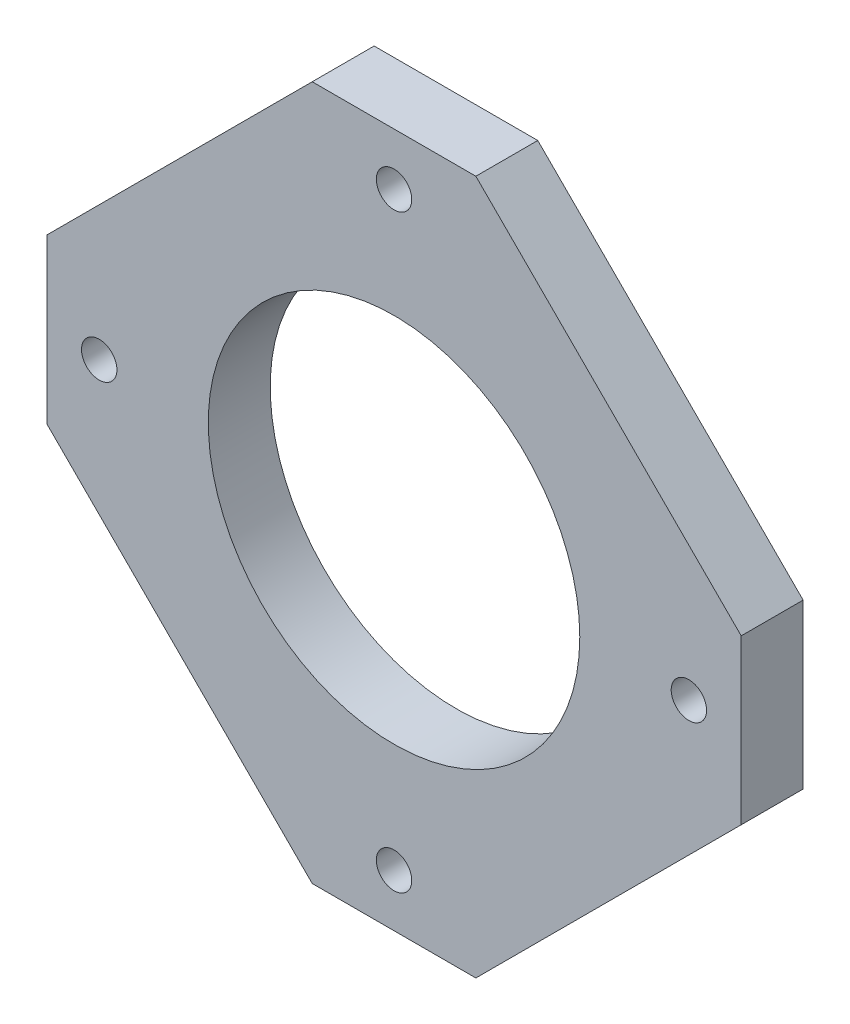
ISO-10303-21;
HEADER;
FILE_DESCRIPTION(('STEP AP214'),'2;1');
FILE_NAME('part.step','',(''),(''),'','','');
FILE_SCHEMA(('AUTOMOTIVE_DESIGN { 1 0 10303 214 1 1 1 1 }'));
ENDSEC;
DATA;
#1=APPLICATION_CONTEXT('core data for automotive mechanical design processes');
#2=APPLICATION_PROTOCOL_DEFINITION('international standard','automotive_design',2000,#1);
#3=PRODUCT_CONTEXT('',#1,'mechanical');
#4=PRODUCT('Part','Part','',(#3));
#5=PRODUCT_RELATED_PRODUCT_CATEGORY('part','',(#4));
#6=PRODUCT_DEFINITION_FORMATION('','',#4);
#7=PRODUCT_DEFINITION_CONTEXT('part definition',#1,'design');
#8=PRODUCT_DEFINITION('design','',#6,#7);
#9=PRODUCT_DEFINITION_SHAPE('','',#8);
#10=(LENGTH_UNIT() NAMED_UNIT(*) SI_UNIT(.MILLI.,.METRE.));
#11=(NAMED_UNIT(*) PLANE_ANGLE_UNIT() SI_UNIT($,.RADIAN.));
#12=(NAMED_UNIT(*) SI_UNIT($,.STERADIAN.) SOLID_ANGLE_UNIT());
#13=UNCERTAINTY_MEASURE_WITH_UNIT(LENGTH_MEASURE(1.E-05),#10,'distance_accuracy_value','');
#14=(GEOMETRIC_REPRESENTATION_CONTEXT(3) GLOBAL_UNCERTAINTY_ASSIGNED_CONTEXT((#13)) GLOBAL_UNIT_ASSIGNED_CONTEXT((#10,
#11,#12)) REPRESENTATION_CONTEXT('',''));
#15=CARTESIAN_POINT('',(0.,0.,0.));
#16=DIRECTION('',(0.,0.,1.));
#17=DIRECTION('',(1.,0.,0.));
#18=AXIS2_PLACEMENT_3D('',#15,#16,#17);
#19=CARTESIAN_POINT('',(39.25,-39.25,3.5));
#20=DIRECTION('',(-1.,0.,0.));
#21=DIRECTION('',(0.,0.,1.));
#22=AXIS2_PLACEMENT_3D('',#19,#20,#21);
#23=PLANE('',#22);
#24=DIRECTION('',(0.,1.,0.));
#25=VECTOR('',#24,1.);
#26=CARTESIAN_POINT('',(39.25,-39.25,3.5));
#27=LINE('',#26,#25);
#28=CARTESIAN_POINT('',(39.25,-9.24999999999999,3.5));
#29=VERTEX_POINT('',#28);
#30=CARTESIAN_POINT('',(39.25,9.24999999999989,3.5));
#31=VERTEX_POINT('',#30);
#32=EDGE_CURVE('E132',#29,#31,#27,.T.);
#33=ORIENTED_EDGE('',*,*,#32,.F.);
#34=DIRECTION('',(0.,0.,-1.));
#35=VECTOR('',#34,1.);
#36=CARTESIAN_POINT('',(39.25,-9.24999999999999,3.5));
#37=LINE('',#36,#35);
#38=CARTESIAN_POINT('',(39.25,-9.24999999999999,-3.5));
#39=VERTEX_POINT('',#38);
#40=EDGE_CURVE('E158',#29,#39,#37,.T.);
#41=ORIENTED_EDGE('',*,*,#40,.T.);
#42=DIRECTION('',(0.,1.,0.));
#43=VECTOR('',#42,1.);
#44=CARTESIAN_POINT('',(39.25,-39.25,-3.5));
#45=LINE('',#44,#43);
#46=CARTESIAN_POINT('',(39.25,9.24999999999989,-3.5));
#47=VERTEX_POINT('',#46);
#48=EDGE_CURVE('E164',#39,#47,#45,.T.);
#49=ORIENTED_EDGE('',*,*,#48,.T.);
#50=DIRECTION('',(0.,0.,1.));
#51=VECTOR('',#50,1.);
#52=CARTESIAN_POINT('',(39.25,9.24999999999989,3.5));
#53=LINE('',#52,#51);
#54=EDGE_CURVE('E156',#47,#31,#53,.T.);
#55=ORIENTED_EDGE('',*,*,#54,.T.);
#56=EDGE_LOOP('',(#33,#41,#49,#55));
#57=FACE_BOUND('',#56,.T.);
#58=ADVANCED_FACE('F39',(#57),#23,.F.);
#59=CARTESIAN_POINT('',(-39.25,39.25,3.5));
#60=DIRECTION('',(0.,-1.,0.));
#61=DIRECTION('',(0.,0.,-1.));
#62=AXIS2_PLACEMENT_3D('',#59,#60,#61);
#63=PLANE('',#62);
#64=DIRECTION('',(-1.,0.,0.));
#65=VECTOR('',#64,1.);
#66=CARTESIAN_POINT('',(-39.25,39.25,3.5));
#67=LINE('',#66,#65);
#68=CARTESIAN_POINT('',(9.24999999999999,39.25,3.5));
#69=VERTEX_POINT('',#68);
#70=CARTESIAN_POINT('',(-9.2499999999999,39.25,3.5));
#71=VERTEX_POINT('',#70);
#72=EDGE_CURVE('E135',#69,#71,#67,.T.);
#73=ORIENTED_EDGE('',*,*,#72,.F.);
#74=DIRECTION('',(0.,0.,-1.));
#75=VECTOR('',#74,1.);
#76=CARTESIAN_POINT('',(9.24999999999999,39.25,3.5));
#77=LINE('',#76,#75);
#78=CARTESIAN_POINT('',(9.24999999999999,39.25,-3.5));
#79=VERTEX_POINT('',#78);
#80=EDGE_CURVE('E11',#69,#79,#77,.T.);
#81=ORIENTED_EDGE('',*,*,#80,.T.);
#82=DIRECTION('',(-1.,0.,0.));
#83=VECTOR('',#82,1.);
#84=CARTESIAN_POINT('',(-39.25,39.25,-3.5));
#85=LINE('',#84,#83);
#86=CARTESIAN_POINT('',(-9.2499999999999,39.25,-3.5));
#87=VERTEX_POINT('',#86);
#88=EDGE_CURVE('E137',#79,#87,#85,.T.);
#89=ORIENTED_EDGE('',*,*,#88,.T.);
#90=DIRECTION('',(0.,0.,1.));
#91=VECTOR('',#90,1.);
#92=CARTESIAN_POINT('',(-9.2499999999999,39.25,3.5));
#93=LINE('',#92,#91);
#94=EDGE_CURVE('E48',#87,#71,#93,.T.);
#95=ORIENTED_EDGE('',*,*,#94,.T.);
#96=EDGE_LOOP('',(#73,#81,#89,#95));
#97=FACE_BOUND('',#96,.T.);
#98=ADVANCED_FACE('F233',(#97),#63,.F.);
#99=CARTESIAN_POINT('',(-39.25,-39.25,3.5));
#100=DIRECTION('',(1.,0.,0.));
#101=DIRECTION('',(0.,0.,-1.));
#102=AXIS2_PLACEMENT_3D('',#99,#100,#101);
#103=PLANE('',#102);
#104=DIRECTION('',(0.,-1.,0.));
#105=VECTOR('',#104,1.);
#106=CARTESIAN_POINT('',(-39.25,-39.25,-3.5));
#107=LINE('',#106,#105);
#108=CARTESIAN_POINT('',(-39.25,9.24999999999999,-3.5));
#109=VERTEX_POINT('',#108);
#110=CARTESIAN_POINT('',(-39.25,-9.24999999999989,-3.5));
#111=VERTEX_POINT('',#110);
#112=EDGE_CURVE('E133',#109,#111,#107,.T.);
#113=ORIENTED_EDGE('',*,*,#112,.T.);
#114=DIRECTION('',(0.,0.,1.));
#115=VECTOR('',#114,1.);
#116=CARTESIAN_POINT('',(-39.25,-9.24999999999989,3.5));
#117=LINE('',#116,#115);
#118=CARTESIAN_POINT('',(-39.25,-9.24999999999989,3.5));
#119=VERTEX_POINT('',#118);
#120=EDGE_CURVE('E111',#111,#119,#117,.T.);
#121=ORIENTED_EDGE('',*,*,#120,.T.);
#122=DIRECTION('',(0.,-1.,0.));
#123=VECTOR('',#122,1.);
#124=CARTESIAN_POINT('',(-39.25,-39.25,3.5));
#125=LINE('',#124,#123);
#126=CARTESIAN_POINT('',(-39.25,9.24999999999999,3.5));
#127=VERTEX_POINT('',#126);
#128=EDGE_CURVE('E176',#127,#119,#125,.T.);
#129=ORIENTED_EDGE('',*,*,#128,.F.);
#130=DIRECTION('',(0.,0.,-1.));
#131=VECTOR('',#130,1.);
#132=CARTESIAN_POINT('',(-39.25,9.24999999999999,3.5));
#133=LINE('',#132,#131);
#134=EDGE_CURVE('E116',#127,#109,#133,.T.);
#135=ORIENTED_EDGE('',*,*,#134,.T.);
#136=EDGE_LOOP('',(#113,#121,#129,#135));
#137=FACE_BOUND('',#136,.T.);
#138=ADVANCED_FACE('F231',(#137),#103,.F.);
#139=CARTESIAN_POINT('',(-39.25,-39.25,3.5));
#140=DIRECTION('',(0.,1.,0.));
#141=DIRECTION('',(0.,0.,1.));
#142=AXIS2_PLACEMENT_3D('',#139,#140,#141);
#143=PLANE('',#142);
#144=DIRECTION('',(1.,0.,0.));
#145=VECTOR('',#144,1.);
#146=CARTESIAN_POINT('',(-39.25,-39.25,3.5));
#147=LINE('',#146,#145);
#148=CARTESIAN_POINT('',(-9.24999999999999,-39.25,3.5));
#149=VERTEX_POINT('',#148);
#150=CARTESIAN_POINT('',(9.24999999999988,-39.25,3.5));
#151=VERTEX_POINT('',#150);
#152=EDGE_CURVE('E126',#149,#151,#147,.T.);
#153=ORIENTED_EDGE('',*,*,#152,.F.);
#154=DIRECTION('',(0.,0.,-1.));
#155=VECTOR('',#154,1.);
#156=CARTESIAN_POINT('',(-9.24999999999999,-39.25,3.5));
#157=LINE('',#156,#155);
#158=CARTESIAN_POINT('',(-9.24999999999999,-39.25,-3.5));
#159=VERTEX_POINT('',#158);
#160=EDGE_CURVE('E110',#149,#159,#157,.T.);
#161=ORIENTED_EDGE('',*,*,#160,.T.);
#162=DIRECTION('',(1.,0.,0.));
#163=VECTOR('',#162,1.);
#164=CARTESIAN_POINT('',(-39.25,-39.25,-3.5));
#165=LINE('',#164,#163);
#166=CARTESIAN_POINT('',(9.24999999999988,-39.25,-3.5));
#167=VERTEX_POINT('',#166);
#168=EDGE_CURVE('E123',#159,#167,#165,.T.);
#169=ORIENTED_EDGE('',*,*,#168,.T.);
#170=DIRECTION('',(0.,0.,1.));
#171=VECTOR('',#170,1.);
#172=CARTESIAN_POINT('',(9.24999999999988,-39.25,3.5));
#173=LINE('',#172,#171);
#174=EDGE_CURVE('E128',#167,#151,#173,.T.);
#175=ORIENTED_EDGE('',*,*,#174,.T.);
#176=EDGE_LOOP('',(#153,#161,#169,#175));
#177=FACE_BOUND('',#176,.T.);
#178=ADVANCED_FACE('F122',(#177),#143,.F.);
#179=CARTESIAN_POINT('',(0.,0.,3.5));
#180=DIRECTION('',(0.,0.,-1.));
#181=DIRECTION('',(-1.,0.,0.));
#182=AXIS2_PLACEMENT_3D('',#179,#180,#181);
#183=PLANE('',#182);
#184=CARTESIAN_POINT('',(0.,33.3330136651338,3.5));
#185=DIRECTION('',(0.,0.,1.));
#186=DIRECTION('',(1.,0.,0.));
#187=AXIS2_PLACEMENT_3D('',#184,#185,#186);
#188=CIRCLE('',#187,2.00000000000001);
#189=CARTESIAN_POINT('',(2.00000000000001,33.3330136651338,3.5));
#190=VERTEX_POINT('',#189);
#191=EDGE_CURVE('E201',#190,#190,#188,.T.);
#192=ORIENTED_EDGE('',*,*,#191,.F.);
#193=EDGE_LOOP('',(#192));
#194=FACE_BOUND('',#193,.T.);
#195=CARTESIAN_POINT('',(-33.3330136651338,0.,3.5));
#196=DIRECTION('',(0.,0.,1.));
#197=DIRECTION('',(1.,0.,0.));
#198=AXIS2_PLACEMENT_3D('',#195,#196,#197);
#199=CIRCLE('',#198,2.00000000000001);
#200=CARTESIAN_POINT('',(-31.3330136651338,0.,3.5));
#201=VERTEX_POINT('',#200);
#202=EDGE_CURVE('E198',#201,#201,#199,.T.);
#203=ORIENTED_EDGE('',*,*,#202,.F.);
#204=EDGE_LOOP('',(#203));
#205=FACE_BOUND('',#204,.T.);
#206=CARTESIAN_POINT('',(0.,-33.3330136651338,3.5));
#207=DIRECTION('',(0.,0.,1.));
#208=DIRECTION('',(1.,0.,0.));
#209=AXIS2_PLACEMENT_3D('',#206,#207,#208);
#210=CIRCLE('',#209,2.00000000000001);
#211=CARTESIAN_POINT('',(2.00000000000001,-33.3330136651338,3.5));
#212=VERTEX_POINT('',#211);
#213=EDGE_CURVE('E192',#212,#212,#210,.T.);
#214=ORIENTED_EDGE('',*,*,#213,.F.);
#215=EDGE_LOOP('',(#214));
#216=FACE_BOUND('',#215,.T.);
#217=CARTESIAN_POINT('',(33.3330136651338,0.,3.5));
#218=DIRECTION('',(0.,0.,1.));
#219=DIRECTION('',(1.,0.,0.));
#220=AXIS2_PLACEMENT_3D('',#217,#218,#219);
#221=CIRCLE('',#220,2.00000000000001);
#222=CARTESIAN_POINT('',(35.3330136651339,0.,3.5));
#223=VERTEX_POINT('',#222);
#224=EDGE_CURVE('E186',#223,#223,#221,.T.);
#225=ORIENTED_EDGE('',*,*,#224,.F.);
#226=EDGE_LOOP('',(#225));
#227=FACE_BOUND('',#226,.T.);
#228=CARTESIAN_POINT('',(0.,0.,3.5));
#229=DIRECTION('',(0.,0.,1.));
#230=DIRECTION('',(1.,0.,0.));
#231=AXIS2_PLACEMENT_3D('',#228,#229,#230);
#232=CIRCLE('',#231,21.);
#233=CARTESIAN_POINT('',(21.,0.,3.5));
#234=VERTEX_POINT('',#233);
#235=EDGE_CURVE('E172',#234,#234,#232,.T.);
#236=ORIENTED_EDGE('',*,*,#235,.F.);
#237=EDGE_LOOP('',(#236));
#238=FACE_BOUND('',#237,.T.);
#239=ORIENTED_EDGE('',*,*,#128,.T.);
#240=DIRECTION('',(-0.707106781186546,0.707106781186549,0.));
#241=VECTOR('',#240,1.);
#242=CARTESIAN_POINT('',(-9.24999999999999,-39.25,3.5));
#243=LINE('',#242,#241);
#244=EDGE_CURVE('E154',#119,#149,#243,.F.);
#245=ORIENTED_EDGE('',*,*,#244,.T.);
#246=ORIENTED_EDGE('',*,*,#152,.T.);
#247=DIRECTION('',(-0.707106781186549,-0.707106781186546,0.));
#248=VECTOR('',#247,1.);
#249=CARTESIAN_POINT('',(39.25,-9.24999999999999,3.5));
#250=LINE('',#249,#248);
#251=EDGE_CURVE('E152',#151,#29,#250,.F.);
#252=ORIENTED_EDGE('',*,*,#251,.T.);
#253=ORIENTED_EDGE('',*,*,#32,.T.);
#254=DIRECTION('',(0.707106781186546,-0.707106781186549,0.));
#255=VECTOR('',#254,1.);
#256=CARTESIAN_POINT('',(9.24999999999999,39.25,3.5));
#257=LINE('',#256,#255);
#258=EDGE_CURVE('E61',#31,#69,#257,.F.);
#259=ORIENTED_EDGE('',*,*,#258,.T.);
#260=ORIENTED_EDGE('',*,*,#72,.T.);
#261=DIRECTION('',(0.707106781186549,0.707106781186546,0.));
#262=VECTOR('',#261,1.);
#263=CARTESIAN_POINT('',(-39.25,9.24999999999999,3.5));
#264=LINE('',#263,#262);
#265=EDGE_CURVE('E149',#71,#127,#264,.F.);
#266=ORIENTED_EDGE('',*,*,#265,.T.);
#267=EDGE_LOOP('',(#239,#245,#246,#252,#253,#259,#260,#266));
#268=FACE_BOUND('',#267,.T.);
#269=ADVANCED_FACE('F216',(#194,#205,#216,#227,#238,#268),#183,.F.);
#270=CARTESIAN_POINT('',(0.,0.,-3.5));
#271=DIRECTION('',(0.,0.,-1.));
#272=DIRECTION('',(-1.,0.,0.));
#273=AXIS2_PLACEMENT_3D('',#270,#271,#272);
#274=PLANE('',#273);
#275=CARTESIAN_POINT('',(0.,33.3330136651338,-3.5));
#276=DIRECTION('',(0.,0.,1.));
#277=DIRECTION('',(1.,0.,0.));
#278=AXIS2_PLACEMENT_3D('',#275,#276,#277);
#279=CIRCLE('',#278,2.00000000000001);
#280=CARTESIAN_POINT('',(2.00000000000001,33.3330136651338,-3.5));
#281=VERTEX_POINT('',#280);
#282=EDGE_CURVE('E181',#281,#281,#279,.T.);
#283=ORIENTED_EDGE('',*,*,#282,.T.);
#284=EDGE_LOOP('',(#283));
#285=FACE_BOUND('',#284,.T.);
#286=CARTESIAN_POINT('',(-33.3330136651338,0.,-3.5));
#287=DIRECTION('',(0.,0.,1.));
#288=DIRECTION('',(1.,0.,0.));
#289=AXIS2_PLACEMENT_3D('',#286,#287,#288);
#290=CIRCLE('',#289,2.00000000000001);
#291=CARTESIAN_POINT('',(-31.3330136651338,0.,-3.5));
#292=VERTEX_POINT('',#291);
#293=EDGE_CURVE('E195',#292,#292,#290,.T.);
#294=ORIENTED_EDGE('',*,*,#293,.T.);
#295=EDGE_LOOP('',(#294));
#296=FACE_BOUND('',#295,.T.);
#297=CARTESIAN_POINT('',(0.,-33.3330136651338,-3.5));
#298=DIRECTION('',(0.,0.,1.));
#299=DIRECTION('',(1.,0.,0.));
#300=AXIS2_PLACEMENT_3D('',#297,#298,#299);
#301=CIRCLE('',#300,2.00000000000001);
#302=CARTESIAN_POINT('',(2.00000000000001,-33.3330136651338,-3.5));
#303=VERTEX_POINT('',#302);
#304=EDGE_CURVE('E189',#303,#303,#301,.T.);
#305=ORIENTED_EDGE('',*,*,#304,.T.);
#306=EDGE_LOOP('',(#305));
#307=FACE_BOUND('',#306,.T.);
#308=CARTESIAN_POINT('',(33.3330136651338,0.,-3.5));
#309=DIRECTION('',(0.,0.,1.));
#310=DIRECTION('',(1.,0.,0.));
#311=AXIS2_PLACEMENT_3D('',#308,#309,#310);
#312=CIRCLE('',#311,2.00000000000001);
#313=CARTESIAN_POINT('',(35.3330136651339,0.,-3.5));
#314=VERTEX_POINT('',#313);
#315=EDGE_CURVE('E183',#314,#314,#312,.T.);
#316=ORIENTED_EDGE('',*,*,#315,.T.);
#317=EDGE_LOOP('',(#316));
#318=FACE_BOUND('',#317,.T.);
#319=CARTESIAN_POINT('',(0.,0.,-3.5));
#320=DIRECTION('',(0.,0.,1.));
#321=DIRECTION('',(1.,0.,0.));
#322=AXIS2_PLACEMENT_3D('',#319,#320,#321);
#323=CIRCLE('',#322,21.);
#324=CARTESIAN_POINT('',(21.,0.,-3.5));
#325=VERTEX_POINT('',#324);
#326=EDGE_CURVE('E169',#325,#325,#323,.T.);
#327=ORIENTED_EDGE('',*,*,#326,.T.);
#328=EDGE_LOOP('',(#327));
#329=FACE_BOUND('',#328,.T.);
#330=ORIENTED_EDGE('',*,*,#168,.F.);
#331=DIRECTION('',(0.707106781186546,-0.707106781186549,0.));
#332=VECTOR('',#331,1.);
#333=CARTESIAN_POINT('',(-24.25,-24.2499999999999,-3.5));
#334=LINE('',#333,#332);
#335=EDGE_CURVE('E106',#159,#111,#334,.F.);
#336=ORIENTED_EDGE('',*,*,#335,.T.);
#337=ORIENTED_EDGE('',*,*,#112,.F.);
#338=DIRECTION('',(-0.707106781186549,-0.707106781186546,0.));
#339=VECTOR('',#338,1.);
#340=CARTESIAN_POINT('',(-24.2499999999999,24.25,-3.5));
#341=LINE('',#340,#339);
#342=EDGE_CURVE('E127',#109,#87,#341,.F.);
#343=ORIENTED_EDGE('',*,*,#342,.T.);
#344=ORIENTED_EDGE('',*,*,#88,.F.);
#345=DIRECTION('',(-0.707106781186546,0.707106781186549,0.));
#346=VECTOR('',#345,1.);
#347=CARTESIAN_POINT('',(24.25,24.2499999999999,-3.5));
#348=LINE('',#347,#346);
#349=EDGE_CURVE('E143',#79,#47,#348,.F.);
#350=ORIENTED_EDGE('',*,*,#349,.T.);
#351=ORIENTED_EDGE('',*,*,#48,.F.);
#352=DIRECTION('',(0.707106781186549,0.707106781186546,0.));
#353=VECTOR('',#352,1.);
#354=CARTESIAN_POINT('',(24.2499999999999,-24.25,-3.5));
#355=LINE('',#354,#353);
#356=EDGE_CURVE('E117',#39,#167,#355,.F.);
#357=ORIENTED_EDGE('',*,*,#356,.T.);
#358=EDGE_LOOP('',(#330,#336,#337,#343,#344,#350,#351,#357));
#359=FACE_BOUND('',#358,.T.);
#360=ADVANCED_FACE('F130',(#285,#296,#307,#318,#329,#359),#274,.T.);
#361=CARTESIAN_POINT('',(0.,0.,-3.5));
#362=DIRECTION('',(0.,0.,1.));
#363=DIRECTION('',(1.,0.,0.));
#364=AXIS2_PLACEMENT_3D('',#361,#362,#363);
#365=CYLINDRICAL_SURFACE('',#364,21.);
#366=ORIENTED_EDGE('',*,*,#326,.F.);
#367=EDGE_LOOP('',(#366));
#368=FACE_BOUND('',#367,.T.);
#369=ORIENTED_EDGE('',*,*,#235,.T.);
#370=EDGE_LOOP('',(#369));
#371=FACE_BOUND('',#370,.T.);
#372=ADVANCED_FACE('F268',(#368,#371),#365,.F.);
#373=CARTESIAN_POINT('',(33.3330136651338,0.,-3.5));
#374=DIRECTION('',(0.,0.,1.));
#375=DIRECTION('',(1.,0.,0.));
#376=AXIS2_PLACEMENT_3D('',#373,#374,#375);
#377=CYLINDRICAL_SURFACE('',#376,2.00000000000001);
#378=ORIENTED_EDGE('',*,*,#315,.F.);
#379=EDGE_LOOP('',(#378));
#380=FACE_BOUND('',#379,.T.);
#381=ORIENTED_EDGE('',*,*,#224,.T.);
#382=EDGE_LOOP('',(#381));
#383=FACE_BOUND('',#382,.T.);
#384=ADVANCED_FACE('F272',(#380,#383),#377,.F.);
#385=CARTESIAN_POINT('',(0.,-33.3330136651338,-3.5));
#386=DIRECTION('',(0.,0.,1.));
#387=DIRECTION('',(1.,0.,0.));
#388=AXIS2_PLACEMENT_3D('',#385,#386,#387);
#389=CYLINDRICAL_SURFACE('',#388,2.00000000000001);
#390=ORIENTED_EDGE('',*,*,#304,.F.);
#391=EDGE_LOOP('',(#390));
#392=FACE_BOUND('',#391,.T.);
#393=ORIENTED_EDGE('',*,*,#213,.T.);
#394=EDGE_LOOP('',(#393));
#395=FACE_BOUND('',#394,.T.);
#396=ADVANCED_FACE('F276',(#392,#395),#389,.F.);
#397=CARTESIAN_POINT('',(-33.3330136651338,0.,-3.5));
#398=DIRECTION('',(0.,0.,1.));
#399=DIRECTION('',(1.,0.,0.));
#400=AXIS2_PLACEMENT_3D('',#397,#398,#399);
#401=CYLINDRICAL_SURFACE('',#400,2.00000000000001);
#402=ORIENTED_EDGE('',*,*,#293,.F.);
#403=EDGE_LOOP('',(#402));
#404=FACE_BOUND('',#403,.T.);
#405=ORIENTED_EDGE('',*,*,#202,.T.);
#406=EDGE_LOOP('',(#405));
#407=FACE_BOUND('',#406,.T.);
#408=ADVANCED_FACE('F212',(#404,#407),#401,.F.);
#409=CARTESIAN_POINT('',(0.,33.3330136651338,-3.5));
#410=DIRECTION('',(0.,0.,1.));
#411=DIRECTION('',(1.,0.,0.));
#412=AXIS2_PLACEMENT_3D('',#409,#410,#411);
#413=CYLINDRICAL_SURFACE('',#412,2.00000000000001);
#414=ORIENTED_EDGE('',*,*,#282,.F.);
#415=EDGE_LOOP('',(#414));
#416=FACE_BOUND('',#415,.T.);
#417=ORIENTED_EDGE('',*,*,#191,.T.);
#418=EDGE_LOOP('',(#417));
#419=FACE_BOUND('',#418,.T.);
#420=ADVANCED_FACE('F209',(#416,#419),#413,.F.);
#421=CARTESIAN_POINT('',(-9.24999999999999,-39.25,3.5));
#422=DIRECTION('',(0.707106781186549,0.707106781186546,0.));
#423=DIRECTION('',(0.,0.,-1.));
#424=AXIS2_PLACEMENT_3D('',#421,#422,#423);
#425=PLANE('',#424);
#426=ORIENTED_EDGE('',*,*,#244,.F.);
#427=ORIENTED_EDGE('',*,*,#120,.F.);
#428=ORIENTED_EDGE('',*,*,#335,.F.);
#429=ORIENTED_EDGE('',*,*,#160,.F.);
#430=EDGE_LOOP('',(#426,#427,#428,#429));
#431=FACE_BOUND('',#430,.T.);
#432=ADVANCED_FACE('F109',(#431),#425,.F.);
#433=CARTESIAN_POINT('',(39.25,-9.24999999999999,3.5));
#434=DIRECTION('',(-0.707106781186546,0.707106781186549,0.));
#435=DIRECTION('',(0.,0.,-1.));
#436=AXIS2_PLACEMENT_3D('',#433,#434,#435);
#437=PLANE('',#436);
#438=ORIENTED_EDGE('',*,*,#251,.F.);
#439=ORIENTED_EDGE('',*,*,#174,.F.);
#440=ORIENTED_EDGE('',*,*,#356,.F.);
#441=ORIENTED_EDGE('',*,*,#40,.F.);
#442=EDGE_LOOP('',(#438,#439,#440,#441));
#443=FACE_BOUND('',#442,.T.);
#444=ADVANCED_FACE('F237',(#443),#437,.F.);
#445=CARTESIAN_POINT('',(9.24999999999999,39.25,3.5));
#446=DIRECTION('',(-0.707106781186549,-0.707106781186546,0.));
#447=DIRECTION('',(0.,0.,-1.));
#448=AXIS2_PLACEMENT_3D('',#445,#446,#447);
#449=PLANE('',#448);
#450=ORIENTED_EDGE('',*,*,#258,.F.);
#451=ORIENTED_EDGE('',*,*,#54,.F.);
#452=ORIENTED_EDGE('',*,*,#349,.F.);
#453=ORIENTED_EDGE('',*,*,#80,.F.);
#454=EDGE_LOOP('',(#450,#451,#452,#453));
#455=FACE_BOUND('',#454,.T.);
#456=ADVANCED_FACE('F236',(#455),#449,.F.);
#457=CARTESIAN_POINT('',(-39.25,9.24999999999999,3.5));
#458=DIRECTION('',(0.707106781186546,-0.707106781186549,0.));
#459=DIRECTION('',(0.,0.,-1.));
#460=AXIS2_PLACEMENT_3D('',#457,#458,#459);
#461=PLANE('',#460);
#462=ORIENTED_EDGE('',*,*,#265,.F.);
#463=ORIENTED_EDGE('',*,*,#94,.F.);
#464=ORIENTED_EDGE('',*,*,#342,.F.);
#465=ORIENTED_EDGE('',*,*,#134,.F.);
#466=EDGE_LOOP('',(#462,#463,#464,#465));
#467=FACE_BOUND('',#466,.T.);
#468=ADVANCED_FACE('F42',(#467),#461,.F.);
#469=CLOSED_SHELL('',(#58,#98,#138,#178,#269,#360,#372,#384,#396,#408,#420,#432,#444,#456,#468));
#470=MANIFOLD_SOLID_BREP('B2',#469);
#471=ADVANCED_BREP_SHAPE_REPRESENTATION('',(#18,#470),#14);
#472=SHAPE_DEFINITION_REPRESENTATION(#9,#471);
ENDSEC;
END-ISO-10303-21;
